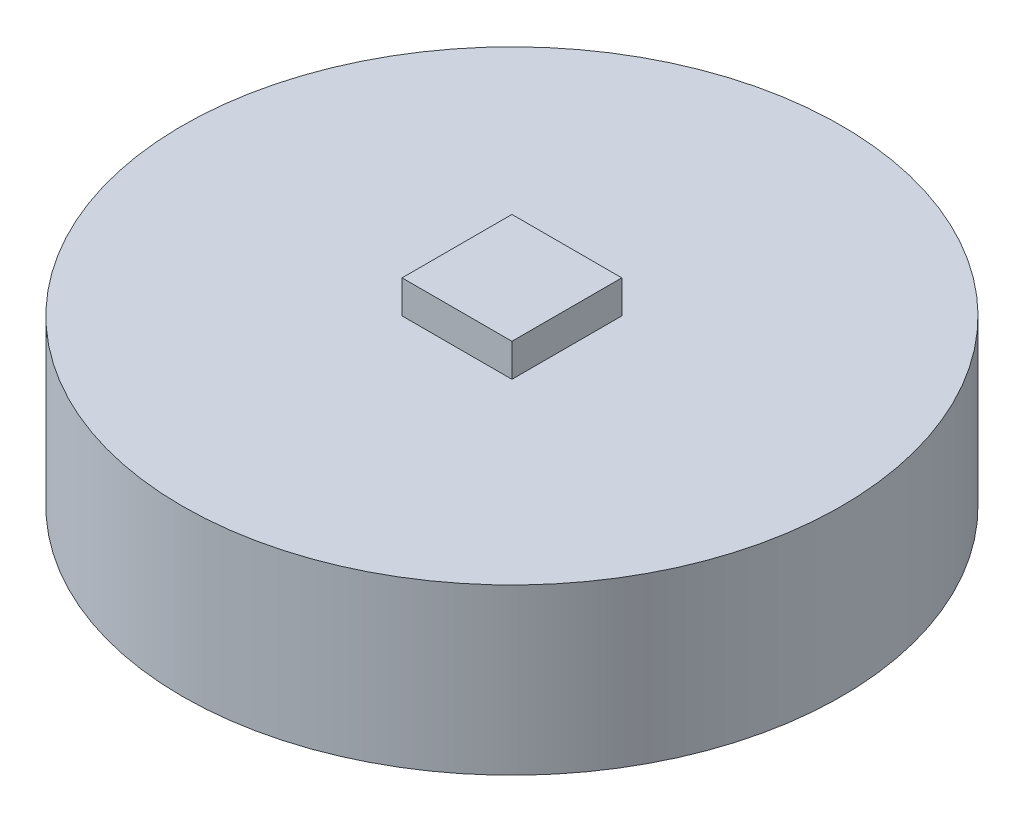
ISO-10303-21;
HEADER;
FILE_DESCRIPTION(('STEP AP214'),'2;1');
FILE_NAME('part.step','',(''),(''),'','','');
FILE_SCHEMA(('AUTOMOTIVE_DESIGN { 1 0 10303 214 1 1 1 1 }'));
ENDSEC;
DATA;
#1=APPLICATION_CONTEXT('core data for automotive mechanical design processes');
#2=APPLICATION_PROTOCOL_DEFINITION('international standard','automotive_design',2000,#1);
#3=PRODUCT_CONTEXT('',#1,'mechanical');
#4=PRODUCT('Part','Part','',(#3));
#5=PRODUCT_RELATED_PRODUCT_CATEGORY('part','',(#4));
#6=PRODUCT_DEFINITION_FORMATION('','',#4);
#7=PRODUCT_DEFINITION_CONTEXT('part definition',#1,'design');
#8=PRODUCT_DEFINITION('design','',#6,#7);
#9=PRODUCT_DEFINITION_SHAPE('','',#8);
#10=(LENGTH_UNIT() NAMED_UNIT(*) SI_UNIT(.MILLI.,.METRE.));
#11=(NAMED_UNIT(*) PLANE_ANGLE_UNIT() SI_UNIT($,.RADIAN.));
#12=(NAMED_UNIT(*) SI_UNIT($,.STERADIAN.) SOLID_ANGLE_UNIT());
#13=UNCERTAINTY_MEASURE_WITH_UNIT(LENGTH_MEASURE(1.E-05),#10,'distance_accuracy_value','');
#14=(GEOMETRIC_REPRESENTATION_CONTEXT(3) GLOBAL_UNCERTAINTY_ASSIGNED_CONTEXT((#13)) GLOBAL_UNIT_ASSIGNED_CONTEXT((#10,
#11,#12)) REPRESENTATION_CONTEXT('',''));
#15=CARTESIAN_POINT('',(0.,0.,0.));
#16=DIRECTION('',(0.,0.,1.));
#17=DIRECTION('',(1.,0.,0.));
#18=AXIS2_PLACEMENT_3D('',#15,#16,#17);
#19=CARTESIAN_POINT('',(0.,15.,0.));
#20=DIRECTION('',(0.,-1.,0.));
#21=DIRECTION('',(0.,0.,-1.));
#22=AXIS2_PLACEMENT_3D('',#19,#20,#21);
#23=CYLINDRICAL_SURFACE('',#22,30.);
#24=CARTESIAN_POINT('',(0.,15.,0.));
#25=DIRECTION('',(0.,1.,0.));
#26=DIRECTION('',(0.,0.,1.));
#27=AXIS2_PLACEMENT_3D('',#24,#25,#26);
#28=CIRCLE('',#27,30.);
#29=CARTESIAN_POINT('',(0.,15.,30.));
#30=VERTEX_POINT('',#29);
#31=EDGE_CURVE('E11',#30,#30,#28,.T.);
#32=ORIENTED_EDGE('',*,*,#31,.F.);
#33=EDGE_LOOP('',(#32));
#34=FACE_BOUND('',#33,.T.);
#35=CARTESIAN_POINT('',(0.,0.,0.));
#36=DIRECTION('',(0.,1.,0.));
#37=DIRECTION('',(0.,0.,1.));
#38=AXIS2_PLACEMENT_3D('',#35,#36,#37);
#39=CIRCLE('',#38,30.);
#40=CARTESIAN_POINT('',(0.,0.,30.));
#41=VERTEX_POINT('',#40);
#42=EDGE_CURVE('E40',#41,#41,#39,.T.);
#43=ORIENTED_EDGE('',*,*,#42,.T.);
#44=EDGE_LOOP('',(#43));
#45=FACE_BOUND('',#44,.T.);
#46=ADVANCED_FACE('F37',(#34,#45),#23,.T.);
#47=CARTESIAN_POINT('',(0.,15.,0.));
#48=DIRECTION('',(0.,1.,0.));
#49=DIRECTION('',(0.,0.,1.));
#50=AXIS2_PLACEMENT_3D('',#47,#48,#49);
#51=PLANE('',#50);
#52=DIRECTION('',(0.,0.,-1.));
#53=VECTOR('',#52,1.);
#54=CARTESIAN_POINT('',(5.,15.,5.));
#55=LINE('',#54,#53);
#56=CARTESIAN_POINT('',(5.,15.,5.));
#57=VERTEX_POINT('',#56);
#58=CARTESIAN_POINT('',(5.,15.,-5.));
#59=VERTEX_POINT('',#58);
#60=EDGE_CURVE('E59',#57,#59,#55,.T.);
#61=ORIENTED_EDGE('',*,*,#60,.F.);
#62=DIRECTION('',(1.,0.,0.));
#63=VECTOR('',#62,1.);
#64=CARTESIAN_POINT('',(-5.,15.,5.));
#65=LINE('',#64,#63);
#66=CARTESIAN_POINT('',(-5.,15.,5.));
#67=VERTEX_POINT('',#66);
#68=EDGE_CURVE('E143',#67,#57,#65,.T.);
#69=ORIENTED_EDGE('',*,*,#68,.F.);
#70=DIRECTION('',(0.,0.,1.));
#71=VECTOR('',#70,1.);
#72=CARTESIAN_POINT('',(-5.,15.,5.));
#73=LINE('',#72,#71);
#74=CARTESIAN_POINT('',(-5.,15.,-5.));
#75=VERTEX_POINT('',#74);
#76=EDGE_CURVE('E154',#75,#67,#73,.T.);
#77=ORIENTED_EDGE('',*,*,#76,.F.);
#78=DIRECTION('',(-1.,0.,0.));
#79=VECTOR('',#78,1.);
#80=CARTESIAN_POINT('',(-5.,15.,-5.));
#81=LINE('',#80,#79);
#82=EDGE_CURVE('E151',#59,#75,#81,.T.);
#83=ORIENTED_EDGE('',*,*,#82,.F.);
#84=EDGE_LOOP('',(#61,#69,#77,#83));
#85=FACE_BOUND('',#84,.T.);
#86=ORIENTED_EDGE('',*,*,#31,.T.);
#87=EDGE_LOOP('',(#86));
#88=FACE_BOUND('',#87,.T.);
#89=ADVANCED_FACE('F177',(#85,#88),#51,.T.);
#90=CARTESIAN_POINT('',(0.,0.,0.));
#91=DIRECTION('',(0.,1.,0.));
#92=DIRECTION('',(0.,0.,1.));
#93=AXIS2_PLACEMENT_3D('',#90,#91,#92);
#94=PLANE('',#93);
#95=DIRECTION('',(1.,0.,0.));
#96=VECTOR('',#95,1.);
#97=CARTESIAN_POINT('',(5.,0.,-5.));
#98=LINE('',#97,#96);
#99=CARTESIAN_POINT('',(-5.,0.,-5.));
#100=VERTEX_POINT('',#99);
#101=CARTESIAN_POINT('',(5.,0.,-5.));
#102=VERTEX_POINT('',#101);
#103=EDGE_CURVE('E130',#100,#102,#98,.T.);
#104=ORIENTED_EDGE('',*,*,#103,.F.);
#105=DIRECTION('',(0.,0.,-1.));
#106=VECTOR('',#105,1.);
#107=CARTESIAN_POINT('',(-5.,0.,5.));
#108=LINE('',#107,#106);
#109=CARTESIAN_POINT('',(-5.,0.,5.));
#110=VERTEX_POINT('',#109);
#111=EDGE_CURVE('E51',#110,#100,#108,.T.);
#112=ORIENTED_EDGE('',*,*,#111,.F.);
#113=DIRECTION('',(-1.,0.,0.));
#114=VECTOR('',#113,1.);
#115=CARTESIAN_POINT('',(5.,0.,5.));
#116=LINE('',#115,#114);
#117=CARTESIAN_POINT('',(5.,0.,5.));
#118=VERTEX_POINT('',#117);
#119=EDGE_CURVE('E121',#118,#110,#116,.T.);
#120=ORIENTED_EDGE('',*,*,#119,.F.);
#121=DIRECTION('',(0.,0.,1.));
#122=VECTOR('',#121,1.);
#123=CARTESIAN_POINT('',(5.,0.,5.));
#124=LINE('',#123,#122);
#125=EDGE_CURVE('E124',#102,#118,#124,.T.);
#126=ORIENTED_EDGE('',*,*,#125,.F.);
#127=EDGE_LOOP('',(#104,#112,#120,#126));
#128=FACE_BOUND('',#127,.T.);
#129=ORIENTED_EDGE('',*,*,#42,.F.);
#130=EDGE_LOOP('',(#129));
#131=FACE_BOUND('',#130,.T.);
#132=ADVANCED_FACE('F174',(#128,#131),#94,.F.);
#133=CARTESIAN_POINT('',(5.,18.,5.));
#134=DIRECTION('',(-1.,0.,0.));
#135=DIRECTION('',(0.,0.,1.));
#136=AXIS2_PLACEMENT_3D('',#133,#134,#135);
#137=PLANE('',#136);
#138=ORIENTED_EDGE('',*,*,#60,.T.);
#139=DIRECTION('',(0.,-1.,0.));
#140=VECTOR('',#139,1.);
#141=CARTESIAN_POINT('',(5.,18.,-5.));
#142=LINE('',#141,#140);
#143=CARTESIAN_POINT('',(5.,18.,-5.));
#144=VERTEX_POINT('',#143);
#145=EDGE_CURVE('E166',#144,#59,#142,.T.);
#146=ORIENTED_EDGE('',*,*,#145,.F.);
#147=DIRECTION('',(0.,0.,-1.));
#148=VECTOR('',#147,1.);
#149=CARTESIAN_POINT('',(5.,18.,5.));
#150=LINE('',#149,#148);
#151=CARTESIAN_POINT('',(5.,18.,5.));
#152=VERTEX_POINT('',#151);
#153=EDGE_CURVE('E139',#152,#144,#150,.T.);
#154=ORIENTED_EDGE('',*,*,#153,.F.);
#155=DIRECTION('',(0.,-1.,0.));
#156=VECTOR('',#155,1.);
#157=CARTESIAN_POINT('',(5.,18.,5.));
#158=LINE('',#157,#156);
#159=EDGE_CURVE('E149',#152,#57,#158,.T.);
#160=ORIENTED_EDGE('',*,*,#159,.T.);
#161=EDGE_LOOP('',(#138,#146,#154,#160));
#162=FACE_BOUND('',#161,.T.);
#163=ADVANCED_FACE('F176',(#162),#137,.F.);
#164=CARTESIAN_POINT('',(-5.,18.,-5.));
#165=DIRECTION('',(0.,0.,1.));
#166=DIRECTION('',(1.,0.,0.));
#167=AXIS2_PLACEMENT_3D('',#164,#165,#166);
#168=PLANE('',#167);
#169=ORIENTED_EDGE('',*,*,#82,.T.);
#170=DIRECTION('',(0.,-1.,0.));
#171=VECTOR('',#170,1.);
#172=CARTESIAN_POINT('',(-5.,18.,-5.));
#173=LINE('',#172,#171);
#174=CARTESIAN_POINT('',(-5.,18.,-5.));
#175=VERTEX_POINT('',#174);
#176=EDGE_CURVE('E163',#175,#75,#173,.T.);
#177=ORIENTED_EDGE('',*,*,#176,.F.);
#178=DIRECTION('',(-1.,0.,0.));
#179=VECTOR('',#178,1.);
#180=CARTESIAN_POINT('',(-5.,18.,-5.));
#181=LINE('',#180,#179);
#182=EDGE_CURVE('E142',#144,#175,#181,.T.);
#183=ORIENTED_EDGE('',*,*,#182,.F.);
#184=ORIENTED_EDGE('',*,*,#145,.T.);
#185=EDGE_LOOP('',(#169,#177,#183,#184));
#186=FACE_BOUND('',#185,.T.);
#187=ADVANCED_FACE('F183',(#186),#168,.F.);
#188=CARTESIAN_POINT('',(-5.,18.,5.));
#189=DIRECTION('',(1.,0.,0.));
#190=DIRECTION('',(0.,0.,-1.));
#191=AXIS2_PLACEMENT_3D('',#188,#189,#190);
#192=PLANE('',#191);
#193=ORIENTED_EDGE('',*,*,#76,.T.);
#194=DIRECTION('',(0.,-1.,0.));
#195=VECTOR('',#194,1.);
#196=CARTESIAN_POINT('',(-5.,18.,5.));
#197=LINE('',#196,#195);
#198=CARTESIAN_POINT('',(-5.,18.,5.));
#199=VERTEX_POINT('',#198);
#200=EDGE_CURVE('E160',#199,#67,#197,.T.);
#201=ORIENTED_EDGE('',*,*,#200,.F.);
#202=DIRECTION('',(0.,0.,1.));
#203=VECTOR('',#202,1.);
#204=CARTESIAN_POINT('',(-5.,18.,5.));
#205=LINE('',#204,#203);
#206=EDGE_CURVE('E145',#175,#199,#205,.T.);
#207=ORIENTED_EDGE('',*,*,#206,.F.);
#208=ORIENTED_EDGE('',*,*,#176,.T.);
#209=EDGE_LOOP('',(#193,#201,#207,#208));
#210=FACE_BOUND('',#209,.T.);
#211=ADVANCED_FACE('F213',(#210),#192,.F.);
#212=CARTESIAN_POINT('',(-5.,18.,5.));
#213=DIRECTION('',(0.,0.,-1.));
#214=DIRECTION('',(-1.,0.,0.));
#215=AXIS2_PLACEMENT_3D('',#212,#213,#214);
#216=PLANE('',#215);
#217=ORIENTED_EDGE('',*,*,#68,.T.);
#218=ORIENTED_EDGE('',*,*,#159,.F.);
#219=DIRECTION('',(1.,0.,0.));
#220=VECTOR('',#219,1.);
#221=CARTESIAN_POINT('',(-5.,18.,5.));
#222=LINE('',#221,#220);
#223=EDGE_CURVE('E147',#199,#152,#222,.T.);
#224=ORIENTED_EDGE('',*,*,#223,.F.);
#225=ORIENTED_EDGE('',*,*,#200,.T.);
#226=EDGE_LOOP('',(#217,#218,#224,#225));
#227=FACE_BOUND('',#226,.T.);
#228=ADVANCED_FACE('F222',(#227),#216,.F.);
#229=CARTESIAN_POINT('',(0.,18.,0.));
#230=DIRECTION('',(0.,-1.,0.));
#231=DIRECTION('',(0.,0.,-1.));
#232=AXIS2_PLACEMENT_3D('',#229,#230,#231);
#233=PLANE('',#232);
#234=ORIENTED_EDGE('',*,*,#153,.T.);
#235=ORIENTED_EDGE('',*,*,#182,.T.);
#236=ORIENTED_EDGE('',*,*,#206,.T.);
#237=ORIENTED_EDGE('',*,*,#223,.T.);
#238=EDGE_LOOP('',(#234,#235,#236,#237));
#239=FACE_BOUND('',#238,.T.);
#240=ADVANCED_FACE('F232',(#239),#233,.F.);
#241=CARTESIAN_POINT('',(-5.,3.,5.));
#242=DIRECTION('',(-1.,0.,0.));
#243=DIRECTION('',(0.,0.,1.));
#244=AXIS2_PLACEMENT_3D('',#241,#242,#243);
#245=PLANE('',#244);
#246=ORIENTED_EDGE('',*,*,#111,.T.);
#247=DIRECTION('',(0.,-1.,0.));
#248=VECTOR('',#247,1.);
#249=CARTESIAN_POINT('',(-5.,3.,-5.));
#250=LINE('',#249,#248);
#251=CARTESIAN_POINT('',(-5.,3.,-5.));
#252=VERTEX_POINT('',#251);
#253=EDGE_CURVE('E99',#252,#100,#250,.T.);
#254=ORIENTED_EDGE('',*,*,#253,.F.);
#255=DIRECTION('',(0.,0.,-1.));
#256=VECTOR('',#255,1.);
#257=CARTESIAN_POINT('',(-5.,3.,5.));
#258=LINE('',#257,#256);
#259=CARTESIAN_POINT('',(-5.,3.,5.));
#260=VERTEX_POINT('',#259);
#261=EDGE_CURVE('E103',#260,#252,#258,.T.);
#262=ORIENTED_EDGE('',*,*,#261,.F.);
#263=DIRECTION('',(0.,-1.,0.));
#264=VECTOR('',#263,1.);
#265=CARTESIAN_POINT('',(-5.,3.,5.));
#266=LINE('',#265,#264);
#267=EDGE_CURVE('E134',#260,#110,#266,.T.);
#268=ORIENTED_EDGE('',*,*,#267,.T.);
#269=EDGE_LOOP('',(#246,#254,#262,#268));
#270=FACE_BOUND('',#269,.T.);
#271=ADVANCED_FACE('F101',(#270),#245,.F.);
#272=CARTESIAN_POINT('',(5.,3.,5.));
#273=DIRECTION('',(0.,0.,1.));
#274=DIRECTION('',(1.,0.,0.));
#275=AXIS2_PLACEMENT_3D('',#272,#273,#274);
#276=PLANE('',#275);
#277=ORIENTED_EDGE('',*,*,#119,.T.);
#278=ORIENTED_EDGE('',*,*,#267,.F.);
#279=DIRECTION('',(-1.,0.,0.));
#280=VECTOR('',#279,1.);
#281=CARTESIAN_POINT('',(5.,3.,5.));
#282=LINE('',#281,#280);
#283=CARTESIAN_POINT('',(5.,3.,5.));
#284=VERTEX_POINT('',#283);
#285=EDGE_CURVE('E109',#284,#260,#282,.T.);
#286=ORIENTED_EDGE('',*,*,#285,.F.);
#287=DIRECTION('',(0.,-1.,0.));
#288=VECTOR('',#287,1.);
#289=CARTESIAN_POINT('',(5.,3.,5.));
#290=LINE('',#289,#288);
#291=EDGE_CURVE('E136',#284,#118,#290,.T.);
#292=ORIENTED_EDGE('',*,*,#291,.T.);
#293=EDGE_LOOP('',(#277,#278,#286,#292));
#294=FACE_BOUND('',#293,.T.);
#295=ADVANCED_FACE('F254',(#294),#276,.F.);
#296=CARTESIAN_POINT('',(5.,3.,5.));
#297=DIRECTION('',(1.,0.,0.));
#298=DIRECTION('',(0.,0.,-1.));
#299=AXIS2_PLACEMENT_3D('',#296,#297,#298);
#300=PLANE('',#299);
#301=ORIENTED_EDGE('',*,*,#125,.T.);
#302=ORIENTED_EDGE('',*,*,#291,.F.);
#303=DIRECTION('',(0.,0.,1.));
#304=VECTOR('',#303,1.);
#305=CARTESIAN_POINT('',(5.,3.,5.));
#306=LINE('',#305,#304);
#307=CARTESIAN_POINT('',(5.,3.,-5.));
#308=VERTEX_POINT('',#307);
#309=EDGE_CURVE('E117',#308,#284,#306,.T.);
#310=ORIENTED_EDGE('',*,*,#309,.F.);
#311=DIRECTION('',(0.,-1.,0.));
#312=VECTOR('',#311,1.);
#313=CARTESIAN_POINT('',(5.,3.,-5.));
#314=LINE('',#313,#312);
#315=EDGE_CURVE('E108',#308,#102,#314,.T.);
#316=ORIENTED_EDGE('',*,*,#315,.T.);
#317=EDGE_LOOP('',(#301,#302,#310,#316));
#318=FACE_BOUND('',#317,.T.);
#319=ADVANCED_FACE('F263',(#318),#300,.F.);
#320=CARTESIAN_POINT('',(5.,3.,-5.));
#321=DIRECTION('',(0.,0.,-1.));
#322=DIRECTION('',(-1.,0.,0.));
#323=AXIS2_PLACEMENT_3D('',#320,#321,#322);
#324=PLANE('',#323);
#325=ORIENTED_EDGE('',*,*,#103,.T.);
#326=ORIENTED_EDGE('',*,*,#315,.F.);
#327=DIRECTION('',(1.,0.,0.));
#328=VECTOR('',#327,1.);
#329=CARTESIAN_POINT('',(5.,3.,-5.));
#330=LINE('',#329,#328);
#331=EDGE_CURVE('E112',#252,#308,#330,.T.);
#332=ORIENTED_EDGE('',*,*,#331,.F.);
#333=ORIENTED_EDGE('',*,*,#253,.T.);
#334=EDGE_LOOP('',(#325,#326,#332,#333));
#335=FACE_BOUND('',#334,.T.);
#336=ADVANCED_FACE('F113',(#335),#324,.F.);
#337=CARTESIAN_POINT('',(0.,3.,0.));
#338=DIRECTION('',(0.,1.,0.));
#339=DIRECTION('',(0.,0.,1.));
#340=AXIS2_PLACEMENT_3D('',#337,#338,#339);
#341=PLANE('',#340);
#342=ORIENTED_EDGE('',*,*,#261,.T.);
#343=ORIENTED_EDGE('',*,*,#331,.T.);
#344=ORIENTED_EDGE('',*,*,#309,.T.);
#345=ORIENTED_EDGE('',*,*,#285,.T.);
#346=EDGE_LOOP('',(#342,#343,#344,#345));
#347=FACE_BOUND('',#346,.T.);
#348=ADVANCED_FACE('F119',(#347),#341,.F.);
#349=CLOSED_SHELL('',(#46,#89,#132,#163,#187,#211,#228,#240,#271,#295,#319,#336,#348));
#350=MANIFOLD_SOLID_BREP('B2',#349);
#351=ADVANCED_BREP_SHAPE_REPRESENTATION('',(#18,#350),#14);
#352=SHAPE_DEFINITION_REPRESENTATION(#9,#351);
ENDSEC;
END-ISO-10303-21;
